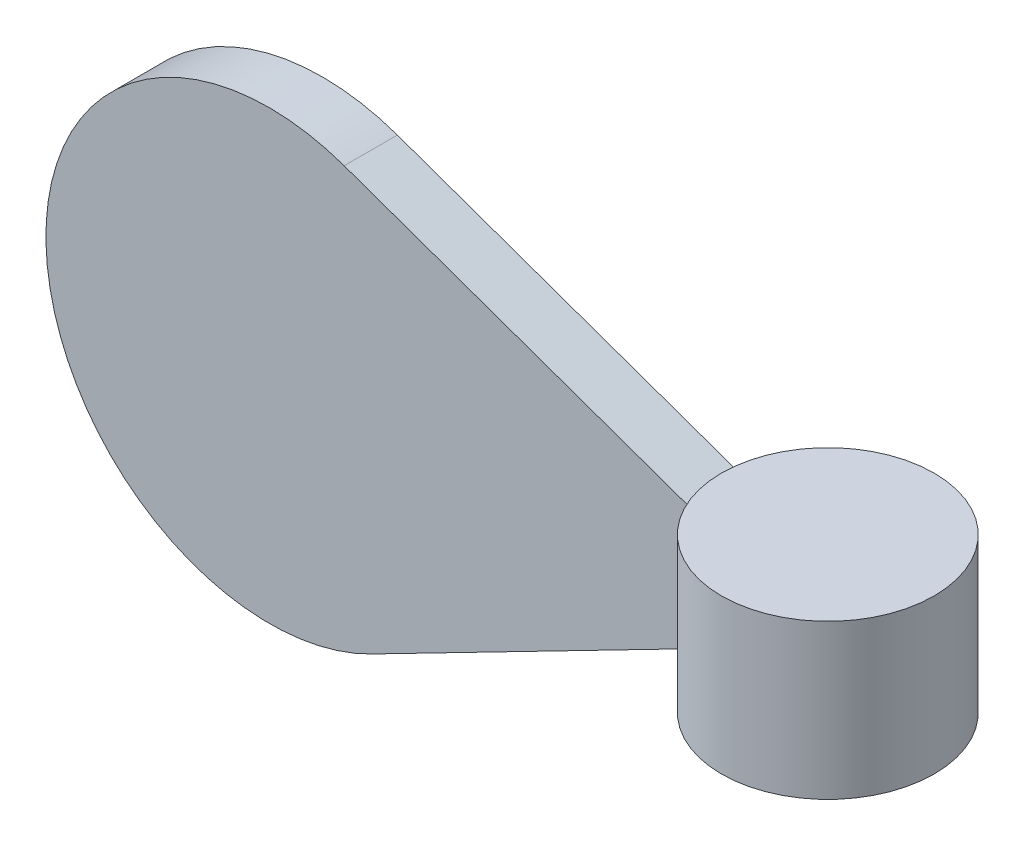
ISO-10303-21;
HEADER;
FILE_DESCRIPTION(('STEP AP214'),'2;1');
FILE_NAME('part.step','',(''),(''),'','','');
FILE_SCHEMA(('AUTOMOTIVE_DESIGN { 1 0 10303 214 1 1 1 1 }'));
ENDSEC;
DATA;
#1=APPLICATION_CONTEXT('core data for automotive mechanical design processes');
#2=APPLICATION_PROTOCOL_DEFINITION('international standard','automotive_design',2000,#1);
#3=PRODUCT_CONTEXT('',#1,'mechanical');
#4=PRODUCT('Part','Part','',(#3));
#5=PRODUCT_RELATED_PRODUCT_CATEGORY('part','',(#4));
#6=PRODUCT_DEFINITION_FORMATION('','',#4);
#7=PRODUCT_DEFINITION_CONTEXT('part definition',#1,'design');
#8=PRODUCT_DEFINITION('design','',#6,#7);
#9=PRODUCT_DEFINITION_SHAPE('','',#8);
#10=(LENGTH_UNIT() NAMED_UNIT(*) SI_UNIT(.MILLI.,.METRE.));
#11=(NAMED_UNIT(*) PLANE_ANGLE_UNIT() SI_UNIT($,.RADIAN.));
#12=(NAMED_UNIT(*) SI_UNIT($,.STERADIAN.) SOLID_ANGLE_UNIT());
#13=UNCERTAINTY_MEASURE_WITH_UNIT(LENGTH_MEASURE(1.E-05),#10,'distance_accuracy_value','');
#14=(GEOMETRIC_REPRESENTATION_CONTEXT(3) GLOBAL_UNCERTAINTY_ASSIGNED_CONTEXT((#13)) GLOBAL_UNIT_ASSIGNED_CONTEXT((#10,
#11,#12)) REPRESENTATION_CONTEXT('',''));
#15=CARTESIAN_POINT('',(0.,0.,0.));
#16=DIRECTION('',(0.,0.,1.));
#17=DIRECTION('',(1.,0.,0.));
#18=AXIS2_PLACEMENT_3D('',#15,#16,#17);
#19=CARTESIAN_POINT('',(19.208719722318,-37.350034626884,25.));
#20=DIRECTION('',(-0.457350469579,0.889286538735333,0.));
#21=DIRECTION('',(-0.889286538735333,-0.457350469579,0.));
#22=AXIS2_PLACEMENT_3D('',#19,#20,#21);
#23=PLANE('',#22);
#24=DIRECTION('',(0.889286538735332,0.457350469579,0.));
#25=VECTOR('',#24,1.);
#26=CARTESIAN_POINT('',(19.208719722318,-37.350034626884,15.));
#27=LINE('',#26,#25);
#28=CARTESIAN_POINT('',(19.208719722318,-37.350034626884,15.));
#29=VERTEX_POINT('',#28);
#30=CARTESIAN_POINT('',(80.6350832689629,-5.75911877591379,15.));
#31=VERTEX_POINT('',#30);
#32=EDGE_CURVE('E112',#29,#31,#27,.T.);
#33=ORIENTED_EDGE('',*,*,#32,.T.);
#34=CARTESIAN_POINT('',(100.,4.20004891023278,20.));
#35=DIRECTION('',(-0.457350469579,0.889286538735333,0.));
#36=DIRECTION('',(0.889286538735333,0.457350469579,0.));
#37=AXIS2_PLACEMENT_3D('',#34,#35,#36);
#38=ELLIPSE('',#37,22.4899389891163,20.);
#39=CARTESIAN_POINT('',(80.6350832689629,-5.7591187759138,25.));
#40=VERTEX_POINT('',#39);
#41=EDGE_CURVE('E62',#31,#40,#38,.T.);
#42=ORIENTED_EDGE('',*,*,#41,.T.);
#43=DIRECTION('',(0.889286538735332,0.457350469579,0.));
#44=VECTOR('',#43,1.);
#45=CARTESIAN_POINT('',(19.208719722318,-37.350034626884,25.));
#46=LINE('',#45,#44);
#47=CARTESIAN_POINT('',(19.208719722318,-37.350034626884,25.));
#48=VERTEX_POINT('',#47);
#49=EDGE_CURVE('E114',#48,#40,#46,.T.);
#50=ORIENTED_EDGE('',*,*,#49,.F.);
#51=DIRECTION('',(0.,0.,-1.));
#52=VECTOR('',#51,1.);
#53=CARTESIAN_POINT('',(19.208719722318,-37.350034626884,25.));
#54=LINE('',#53,#52);
#55=EDGE_CURVE('E100',#48,#29,#54,.T.);
#56=ORIENTED_EDGE('',*,*,#55,.T.);
#57=EDGE_LOOP('',(#33,#42,#50,#56));
#58=FACE_BOUND('',#57,.T.);
#59=ADVANCED_FACE('F39',(#58),#23,.F.);
#60=CARTESIAN_POINT('',(0.,0.,25.));
#61=DIRECTION('',(0.,0.,1.));
#62=DIRECTION('',(1.,0.,0.));
#63=AXIS2_PLACEMENT_3D('',#60,#61,#62);
#64=PLANE('',#63);
#65=DIRECTION('',(0.,1.,0.));
#66=VECTOR('',#65,1.);
#67=CARTESIAN_POINT('',(80.6350832689629,22.7172907254556,25.));
#68=LINE('',#67,#66);
#69=CARTESIAN_POINT('',(80.6350832689629,15.9073805264409,25.));
#70=VERTEX_POINT('',#69);
#71=EDGE_CURVE('E139',#70,#40,#68,.F.);
#72=ORIENTED_EDGE('',*,*,#71,.F.);
#73=DIRECTION('',(-0.942222751750969,0.334986993901005,0.));
#74=VECTOR('',#73,1.);
#75=CARTESIAN_POINT('',(14.0694537438422,39.5733555735407,25.));
#76=LINE('',#75,#74);
#77=CARTESIAN_POINT('',(14.0694537438422,39.5733555735407,25.));
#78=VERTEX_POINT('',#77);
#79=EDGE_CURVE('E122',#70,#78,#76,.T.);
#80=ORIENTED_EDGE('',*,*,#79,.T.);
#81=CARTESIAN_POINT('',(0.,0.,25.));
#82=DIRECTION('',(0.,0.,1.));
#83=DIRECTION('',(1.,0.,0.));
#84=AXIS2_PLACEMENT_3D('',#81,#82,#83);
#85=CIRCLE('',#84,42.);
#86=EDGE_CURVE('E144',#78,#48,#85,.T.);
#87=ORIENTED_EDGE('',*,*,#86,.T.);
#88=ORIENTED_EDGE('',*,*,#49,.T.);
#89=EDGE_LOOP('',(#72,#80,#87,#88));
#90=FACE_BOUND('',#89,.T.);
#91=ADVANCED_FACE('F182',(#90),#64,.T.);
#92=CARTESIAN_POINT('',(0.,0.,15.));
#93=DIRECTION('',(0.,0.,1.));
#94=DIRECTION('',(1.,0.,0.));
#95=AXIS2_PLACEMENT_3D('',#92,#93,#94);
#96=PLANE('',#95);
#97=DIRECTION('',(-0.942222751750969,0.334986993901005,0.));
#98=VECTOR('',#97,1.);
#99=CARTESIAN_POINT('',(14.0694537438422,39.5733555735407,15.));
#100=LINE('',#99,#98);
#101=CARTESIAN_POINT('',(80.6350832689629,15.9073805264409,15.));
#102=VERTEX_POINT('',#101);
#103=CARTESIAN_POINT('',(14.0694537438422,39.5733555735407,15.));
#104=VERTEX_POINT('',#103);
#105=EDGE_CURVE('E119',#102,#104,#100,.T.);
#106=ORIENTED_EDGE('',*,*,#105,.F.);
#107=DIRECTION('',(0.,1.,0.));
#108=VECTOR('',#107,1.);
#109=CARTESIAN_POINT('',(80.6350832689629,22.7172907254556,15.));
#110=LINE('',#109,#108);
#111=EDGE_CURVE('E11',#102,#31,#110,.F.);
#112=ORIENTED_EDGE('',*,*,#111,.T.);
#113=ORIENTED_EDGE('',*,*,#32,.F.);
#114=CARTESIAN_POINT('',(0.,0.,15.));
#115=DIRECTION('',(0.,0.,1.));
#116=DIRECTION('',(1.,0.,0.));
#117=AXIS2_PLACEMENT_3D('',#114,#115,#116);
#118=CIRCLE('',#117,42.);
#119=EDGE_CURVE('E97',#29,#104,#118,.F.);
#120=ORIENTED_EDGE('',*,*,#119,.T.);
#121=EDGE_LOOP('',(#106,#112,#113,#120));
#122=FACE_BOUND('',#121,.T.);
#123=ADVANCED_FACE('F117',(#122),#96,.F.);
#124=CARTESIAN_POINT('',(0.,0.,20.));
#125=DIRECTION('',(0.,0.,-1.));
#126=DIRECTION('',(-1.,0.,0.));
#127=AXIS2_PLACEMENT_3D('',#124,#125,#126);
#128=CYLINDRICAL_SURFACE('',#127,42.);
#129=DIRECTION('',(0.,0.,-1.));
#130=VECTOR('',#129,1.);
#131=CARTESIAN_POINT('',(14.0694537438422,39.5733555735407,25.));
#132=LINE('',#131,#130);
#133=EDGE_CURVE('E103',#78,#104,#132,.T.);
#134=ORIENTED_EDGE('',*,*,#133,.T.);
#135=ORIENTED_EDGE('',*,*,#119,.F.);
#136=ORIENTED_EDGE('',*,*,#55,.F.);
#137=ORIENTED_EDGE('',*,*,#86,.F.);
#138=EDGE_LOOP('',(#134,#135,#136,#137));
#139=FACE_BOUND('',#138,.T.);
#140=ADVANCED_FACE('F41',(#139),#128,.T.);
#141=CARTESIAN_POINT('',(14.0694537438422,39.5733555735407,25.));
#142=DIRECTION('',(-0.334986993901005,-0.942222751750969,0.));
#143=DIRECTION('',(0.942222751750969,-0.334986993901005,0.));
#144=AXIS2_PLACEMENT_3D('',#141,#142,#143);
#145=PLANE('',#144);
#146=ORIENTED_EDGE('',*,*,#79,.F.);
#147=CARTESIAN_POINT('',(100.,9.02260170867366,20.));
#148=DIRECTION('',(-0.334986993901005,-0.942222751750969,0.));
#149=DIRECTION('',(-0.942222751750969,0.334986993901005,0.));
#150=AXIS2_PLACEMENT_3D('',#147,#148,#149);
#151=ELLIPSE('',#150,21.2264031651042,20.);
#152=EDGE_CURVE('E140',#70,#102,#151,.T.);
#153=ORIENTED_EDGE('',*,*,#152,.T.);
#154=ORIENTED_EDGE('',*,*,#105,.T.);
#155=ORIENTED_EDGE('',*,*,#133,.F.);
#156=EDGE_LOOP('',(#146,#153,#154,#155));
#157=FACE_BOUND('',#156,.T.);
#158=ADVANCED_FACE('F172',(#157),#145,.F.);
#159=CARTESIAN_POINT('',(100.,0.,20.));
#160=DIRECTION('',(0.,1.,0.));
#161=DIRECTION('',(-1.,0.,0.));
#162=AXIS2_PLACEMENT_3D('',#159,#160,#161);
#163=SPHERICAL_SURFACE('',#162,15.);
#164=CARTESIAN_POINT('',(100.,-8.99999999999999,20.));
#165=DIRECTION('',(0.,1.,0.));
#166=DIRECTION('',(0.,0.,1.));
#167=AXIS2_PLACEMENT_3D('',#164,#165,#166);
#168=CIRCLE('',#167,12.);
#169=CARTESIAN_POINT('',(100.,-8.99999999999999,32.));
#170=VERTEX_POINT('',#169);
#171=EDGE_CURVE('E108',#170,#170,#168,.T.);
#172=ORIENTED_EDGE('',*,*,#171,.F.);
#173=EDGE_LOOP('',(#172));
#174=FACE_BOUND('',#173,.T.);
#175=CARTESIAN_POINT('',(86.,0.,20.));
#176=DIRECTION('',(-1.,0.,0.));
#177=DIRECTION('',(0.,0.,1.));
#178=AXIS2_PLACEMENT_3D('',#175,#176,#177);
#179=CIRCLE('',#178,5.38516480713447);
#180=CARTESIAN_POINT('',(86.,-1.99999999999989,25.));
#181=VERTEX_POINT('',#180);
#182=CARTESIAN_POINT('',(86.,-2.99999999999999,24.4721359549995));
#183=VERTEX_POINT('',#182);
#184=EDGE_CURVE('E150',#181,#183,#179,.F.);
#185=ORIENTED_EDGE('',*,*,#184,.F.);
#186=CARTESIAN_POINT('',(100.,0.,25.));
#187=DIRECTION('',(0.,0.,1.));
#188=DIRECTION('',(1.,0.,0.));
#189=AXIS2_PLACEMENT_3D('',#186,#187,#188);
#190=CIRCLE('',#189,14.1421356237309);
#191=CARTESIAN_POINT('',(86.,1.9999999999999,25.));
#192=VERTEX_POINT('',#191);
#193=EDGE_CURVE('E154',#181,#192,#190,.F.);
#194=ORIENTED_EDGE('',*,*,#193,.T.);
#195=CARTESIAN_POINT('',(86.,1.99999999999989,15.));
#196=VERTEX_POINT('',#195);
#197=EDGE_CURVE('E54',#196,#192,#179,.F.);
#198=ORIENTED_EDGE('',*,*,#197,.F.);
#199=CARTESIAN_POINT('',(100.,0.,15.));
#200=DIRECTION('',(0.,0.,1.));
#201=DIRECTION('',(1.,0.,0.));
#202=AXIS2_PLACEMENT_3D('',#199,#200,#201);
#203=CIRCLE('',#202,14.1421356237309);
#204=CARTESIAN_POINT('',(86.,-1.99999999999989,15.));
#205=VERTEX_POINT('',#204);
#206=EDGE_CURVE('E47',#205,#196,#203,.F.);
#207=ORIENTED_EDGE('',*,*,#206,.F.);
#208=CARTESIAN_POINT('',(86.,-3.,15.5278640450005));
#209=VERTEX_POINT('',#208);
#210=EDGE_CURVE('E138',#209,#205,#179,.F.);
#211=ORIENTED_EDGE('',*,*,#210,.F.);
#212=CARTESIAN_POINT('',(98.2917745199048,3.32152698120484,20.));
#213=DIRECTION('',(-0.457350469579,0.889286538735333,0.));
#214=DIRECTION('',(-0.889286538735333,-0.457350469579,0.));
#215=AXIS2_PLACEMENT_3D('',#212,#213,#214);
#216=CIRCLE('',#215,14.5275401986118);
#217=EDGE_CURVE('E151',#183,#209,#216,.F.);
#218=ORIENTED_EDGE('',*,*,#217,.F.);
#219=EDGE_LOOP('',(#185,#194,#198,#207,#211,#218));
#220=FACE_BOUND('',#219,.T.);
#221=ADVANCED_FACE('F169',(#174,#220),#163,.F.);
#222=CARTESIAN_POINT('',(80.,20.,20.));
#223=DIRECTION('',(0.,1.,0.));
#224=DIRECTION('',(0.,0.,1.));
#225=AXIS2_PLACEMENT_3D('',#222,#223,#224);
#226=PLANE('',#225);
#227=CARTESIAN_POINT('',(100.,20.,20.));
#228=DIRECTION('',(0.,1.,0.));
#229=DIRECTION('',(0.,0.,1.));
#230=AXIS2_PLACEMENT_3D('',#227,#228,#229);
#231=CIRCLE('',#230,20.);
#232=CARTESIAN_POINT('',(100.,20.,40.));
#233=VERTEX_POINT('',#232);
#234=EDGE_CURVE('E157',#233,#233,#231,.T.);
#235=ORIENTED_EDGE('',*,*,#234,.T.);
#236=EDGE_LOOP('',(#235));
#237=FACE_BOUND('',#236,.T.);
#238=ADVANCED_FACE('F171',(#237),#226,.T.);
#239=CARTESIAN_POINT('',(100.,22.7172907254556,20.));
#240=DIRECTION('',(0.,1.,0.));
#241=DIRECTION('',(0.,0.,1.));
#242=AXIS2_PLACEMENT_3D('',#239,#240,#241);
#243=CYLINDRICAL_SURFACE('',#242,20.);
#244=ORIENTED_EDGE('',*,*,#152,.F.);
#245=ORIENTED_EDGE('',*,*,#71,.T.);
#246=ORIENTED_EDGE('',*,*,#41,.F.);
#247=ORIENTED_EDGE('',*,*,#111,.F.);
#248=EDGE_LOOP('',(#244,#245,#246,#247));
#249=FACE_BOUND('',#248,.T.);
#250=CARTESIAN_POINT('',(100.,-9.,20.));
#251=DIRECTION('',(0.,1.,0.));
#252=DIRECTION('',(0.,0.,1.));
#253=AXIS2_PLACEMENT_3D('',#250,#251,#252);
#254=CIRCLE('',#253,20.);
#255=CARTESIAN_POINT('',(100.,-9.,40.));
#256=VERTEX_POINT('',#255);
#257=EDGE_CURVE('E160',#256,#256,#254,.T.);
#258=ORIENTED_EDGE('',*,*,#257,.T.);
#259=EDGE_LOOP('',(#258));
#260=FACE_BOUND('',#259,.T.);
#261=ORIENTED_EDGE('',*,*,#234,.F.);
#262=EDGE_LOOP('',(#261));
#263=FACE_BOUND('',#262,.T.);
#264=ADVANCED_FACE('F204',(#249,#260,#263),#243,.T.);
#265=CARTESIAN_POINT('',(80.,-9.,20.));
#266=DIRECTION('',(0.,-1.,0.));
#267=DIRECTION('',(0.,0.,-1.));
#268=AXIS2_PLACEMENT_3D('',#265,#266,#267);
#269=PLANE('',#268);
#270=ORIENTED_EDGE('',*,*,#171,.T.);
#271=EDGE_LOOP('',(#270));
#272=FACE_BOUND('',#271,.T.);
#273=ORIENTED_EDGE('',*,*,#257,.F.);
#274=EDGE_LOOP('',(#273));
#275=FACE_BOUND('',#274,.T.);
#276=ADVANCED_FACE('F166',(#272,#275),#269,.T.);
#277=DIRECTION('',(0.,1.,0.));
#278=VECTOR('',#277,1.);
#279=CARTESIAN_POINT('',(86.,14.,15.));
#280=LINE('',#279,#278);
#281=EDGE_CURVE('E124',#205,#196,#280,.T.);
#282=ORIENTED_EDGE('',*,*,#281,.F.);
#283=ORIENTED_EDGE('',*,*,#206,.T.);
#284=EDGE_LOOP('',(#282,#283));
#285=FACE_BOUND('',#284,.T.);
#286=ADVANCED_FACE('F133',(#285),#96,.F.);
#287=DIRECTION('',(0.,0.,-1.));
#288=VECTOR('',#287,1.);
#289=CARTESIAN_POINT('',(86.,-3.,25.));
#290=LINE('',#289,#288);
#291=EDGE_CURVE('E115',#183,#209,#290,.T.);
#292=ORIENTED_EDGE('',*,*,#291,.F.);
#293=ORIENTED_EDGE('',*,*,#217,.T.);
#294=EDGE_LOOP('',(#292,#293));
#295=FACE_BOUND('',#294,.T.);
#296=ADVANCED_FACE('F180',(#295),#23,.F.);
#297=ORIENTED_EDGE('',*,*,#193,.F.);
#298=DIRECTION('',(0.,1.,0.));
#299=VECTOR('',#298,1.);
#300=CARTESIAN_POINT('',(86.,14.,25.));
#301=LINE('',#300,#299);
#302=EDGE_CURVE('E118',#181,#192,#301,.T.);
#303=ORIENTED_EDGE('',*,*,#302,.T.);
#304=EDGE_LOOP('',(#297,#303));
#305=FACE_BOUND('',#304,.T.);
#306=ADVANCED_FACE('F178',(#305),#64,.T.);
#307=CARTESIAN_POINT('',(86.,14.,25.));
#308=DIRECTION('',(-1.,0.,0.));
#309=DIRECTION('',(0.,0.,1.));
#310=AXIS2_PLACEMENT_3D('',#307,#308,#309);
#311=PLANE('',#310);
#312=ORIENTED_EDGE('',*,*,#302,.F.);
#313=ORIENTED_EDGE('',*,*,#184,.T.);
#314=ORIENTED_EDGE('',*,*,#291,.T.);
#315=ORIENTED_EDGE('',*,*,#210,.T.);
#316=ORIENTED_EDGE('',*,*,#281,.T.);
#317=ORIENTED_EDGE('',*,*,#197,.T.);
#318=EDGE_LOOP('',(#312,#313,#314,#315,#316,#317));
#319=FACE_BOUND('',#318,.T.);
#320=ADVANCED_FACE('F137',(#319),#311,.F.);
#321=CLOSED_SHELL('',(#59,#91,#123,#140,#158,#221,#238,#264,#276,#286,#296,#306,#320));
#322=MANIFOLD_SOLID_BREP('B2',#321);
#323=ADVANCED_BREP_SHAPE_REPRESENTATION('',(#18,#322),#14);
#324=SHAPE_DEFINITION_REPRESENTATION(#9,#323);
ENDSEC;
END-ISO-10303-21;
